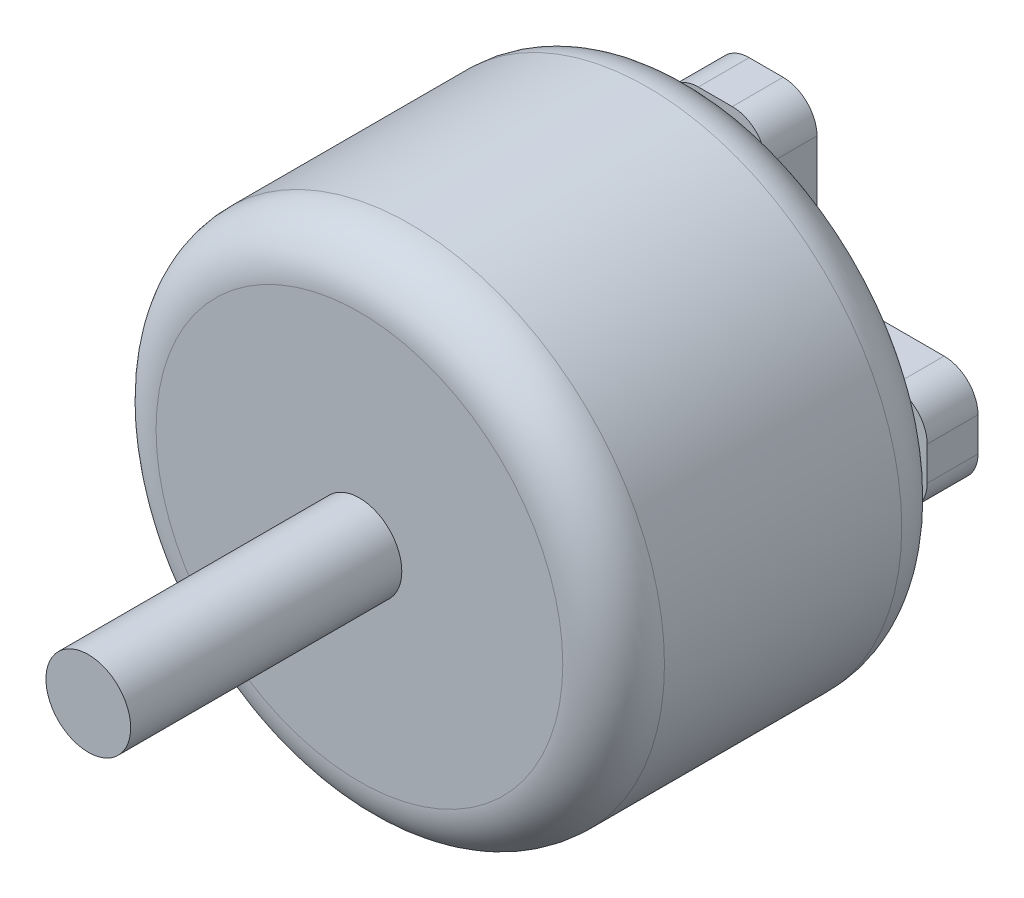
ISO-10303-21;
HEADER;
FILE_DESCRIPTION(('STEP AP214'),'2;1');
FILE_NAME('part.step','',(''),(''),'','','');
FILE_SCHEMA(('AUTOMOTIVE_DESIGN { 1 0 10303 214 1 1 1 1 }'));
ENDSEC;
DATA;
#1=APPLICATION_CONTEXT('core data for automotive mechanical design processes');
#2=APPLICATION_PROTOCOL_DEFINITION('international standard','automotive_design',2000,#1);
#3=PRODUCT_CONTEXT('',#1,'mechanical');
#4=PRODUCT('Part','Part','',(#3));
#5=PRODUCT_RELATED_PRODUCT_CATEGORY('part','',(#4));
#6=PRODUCT_DEFINITION_FORMATION('','',#4);
#7=PRODUCT_DEFINITION_CONTEXT('part definition',#1,'design');
#8=PRODUCT_DEFINITION('design','',#6,#7);
#9=PRODUCT_DEFINITION_SHAPE('','',#8);
#10=(LENGTH_UNIT() NAMED_UNIT(*) SI_UNIT(.MILLI.,.METRE.));
#11=(NAMED_UNIT(*) PLANE_ANGLE_UNIT() SI_UNIT($,.RADIAN.));
#12=(NAMED_UNIT(*) SI_UNIT($,.STERADIAN.) SOLID_ANGLE_UNIT());
#13=UNCERTAINTY_MEASURE_WITH_UNIT(LENGTH_MEASURE(1.E-05),#10,'distance_accuracy_value','');
#14=(GEOMETRIC_REPRESENTATION_CONTEXT(3) GLOBAL_UNCERTAINTY_ASSIGNED_CONTEXT((#13)) GLOBAL_UNIT_ASSIGNED_CONTEXT((#10,
#11,#12)) REPRESENTATION_CONTEXT('',''));
#15=CARTESIAN_POINT('',(0.,0.,0.));
#16=DIRECTION('',(0.,0.,1.));
#17=DIRECTION('',(1.,0.,0.));
#18=AXIS2_PLACEMENT_3D('',#15,#16,#17);
#19=CARTESIAN_POINT('',(-83.7817459305203,-83.7817459305202,3.));
#20=DIRECTION('',(0.,0.,1.));
#21=DIRECTION('',(1.,0.,0.));
#22=AXIS2_PLACEMENT_3D('',#19,#20,#21);
#23=PLANE('',#22);
#24=CARTESIAN_POINT('',(-77.7817459305204,-77.7817459305201,3.));
#25=DIRECTION('',(0.,0.,1.));
#26=DIRECTION('',(1.,0.,0.));
#27=AXIS2_PLACEMENT_3D('',#24,#25,#26);
#28=CIRCLE('',#27,2.85201126427934);
#29=CARTESIAN_POINT('',(-74.9297346662411,-77.7817459305201,3.));
#30=VERTEX_POINT('',#29);
#31=EDGE_CURVE('E371',#30,#30,#28,.T.);
#32=ORIENTED_EDGE('',*,*,#31,.F.);
#33=EDGE_LOOP('',(#32));
#34=FACE_BOUND('',#33,.T.);
#35=CARTESIAN_POINT('',(-77.7817459305203,-87.2817459305201,3.));
#36=DIRECTION('',(0.,0.,1.));
#37=DIRECTION('',(1.,0.,0.));
#38=AXIS2_PLACEMENT_3D('',#35,#36,#37);
#39=CIRCLE('',#38,1.59999999999992);
#40=CARTESIAN_POINT('',(-76.1817459305204,-87.2817459305201,3.));
#41=VERTEX_POINT('',#40);
#42=EDGE_CURVE('E380',#41,#41,#39,.T.);
#43=ORIENTED_EDGE('',*,*,#42,.F.);
#44=EDGE_LOOP('',(#43));
#45=FACE_BOUND('',#44,.T.);
#46=CARTESIAN_POINT('',(-77.7817459305205,-68.2817459305201,3.));
#47=DIRECTION('',(0.,0.,1.));
#48=DIRECTION('',(1.,0.,0.));
#49=AXIS2_PLACEMENT_3D('',#46,#47,#48);
#50=CIRCLE('',#49,1.60000000000002);
#51=CARTESIAN_POINT('',(-76.1817459305204,-68.2817459305201,3.));
#52=VERTEX_POINT('',#51);
#53=EDGE_CURVE('E231',#52,#52,#50,.T.);
#54=ORIENTED_EDGE('',*,*,#53,.F.);
#55=EDGE_LOOP('',(#54));
#56=FACE_BOUND('',#55,.T.);
#57=CARTESIAN_POINT('',(-83.7817459305203,-83.7817459305202,3.));
#58=DIRECTION('',(0.,0.,-1.));
#59=DIRECTION('',(1.,0.,0.));
#60=AXIS2_PLACEMENT_3D('',#57,#58,#59);
#61=CIRCLE('',#60,3.);
#62=CARTESIAN_POINT('',(-83.7817459305203,-80.7817459305202,3.));
#63=VERTEX_POINT('',#62);
#64=CARTESIAN_POINT('',(-80.7817459305203,-83.7817459305202,3.));
#65=VERTEX_POINT('',#64);
#66=EDGE_CURVE('E274',#63,#65,#61,.T.);
#67=ORIENTED_EDGE('',*,*,#66,.T.);
#68=DIRECTION('',(0.,-1.,0.));
#69=VECTOR('',#68,1.);
#70=CARTESIAN_POINT('',(-80.7817459305203,-83.7817459305202,3.));
#71=LINE('',#70,#69);
#72=CARTESIAN_POINT('',(-80.7817459305203,-88.2817459305201,3.));
#73=VERTEX_POINT('',#72);
#74=EDGE_CURVE('E142',#65,#73,#71,.T.);
#75=ORIENTED_EDGE('',*,*,#74,.T.);
#76=CARTESIAN_POINT('',(-78.7817459305203,-88.2817459305201,3.));
#77=DIRECTION('',(0.,0.,1.));
#78=DIRECTION('',(1.,0.,0.));
#79=AXIS2_PLACEMENT_3D('',#76,#77,#78);
#80=CIRCLE('',#79,2.);
#81=CARTESIAN_POINT('',(-78.7817459305203,-90.2817459305201,3.));
#82=VERTEX_POINT('',#81);
#83=EDGE_CURVE('E398',#73,#82,#80,.T.);
#84=ORIENTED_EDGE('',*,*,#83,.T.);
#85=DIRECTION('',(1.,0.,0.));
#86=VECTOR('',#85,1.);
#87=CARTESIAN_POINT('',(-78.7817459305203,-90.2817459305201,3.));
#88=LINE('',#87,#86);
#89=CARTESIAN_POINT('',(-76.7817459305203,-90.2817459305201,3.));
#90=VERTEX_POINT('',#89);
#91=EDGE_CURVE('E400',#82,#90,#88,.T.);
#92=ORIENTED_EDGE('',*,*,#91,.T.);
#93=CARTESIAN_POINT('',(-76.7817459305203,-88.2817459305201,3.));
#94=DIRECTION('',(0.,0.,1.));
#95=DIRECTION('',(1.,0.,0.));
#96=AXIS2_PLACEMENT_3D('',#93,#94,#95);
#97=CIRCLE('',#96,2.);
#98=CARTESIAN_POINT('',(-74.7817459305203,-88.2817459305201,3.));
#99=VERTEX_POINT('',#98);
#100=EDGE_CURVE('E402',#90,#99,#97,.T.);
#101=ORIENTED_EDGE('',*,*,#100,.T.);
#102=DIRECTION('',(0.,1.,0.));
#103=VECTOR('',#102,1.);
#104=CARTESIAN_POINT('',(-74.7817459305203,-83.7817459305202,3.));
#105=LINE('',#104,#103);
#106=CARTESIAN_POINT('',(-74.7817459305203,-83.7817459305202,3.));
#107=VERTEX_POINT('',#106);
#108=EDGE_CURVE('E404',#99,#107,#105,.T.);
#109=ORIENTED_EDGE('',*,*,#108,.T.);
#110=CARTESIAN_POINT('',(-71.7817459305203,-83.7817459305202,3.));
#111=DIRECTION('',(0.,0.,-1.));
#112=DIRECTION('',(-1.,0.,0.));
#113=AXIS2_PLACEMENT_3D('',#110,#111,#112);
#114=CIRCLE('',#113,3.);
#115=CARTESIAN_POINT('',(-71.7817459305203,-80.7817459305202,3.));
#116=VERTEX_POINT('',#115);
#117=EDGE_CURVE('E406',#107,#116,#114,.T.);
#118=ORIENTED_EDGE('',*,*,#117,.T.);
#119=DIRECTION('',(1.,0.,0.));
#120=VECTOR('',#119,1.);
#121=CARTESIAN_POINT('',(-71.7817459305203,-80.7817459305202,3.));
#122=LINE('',#121,#120);
#123=CARTESIAN_POINT('',(-67.2817459305204,-80.7817459305202,3.));
#124=VERTEX_POINT('',#123);
#125=EDGE_CURVE('E408',#116,#124,#122,.T.);
#126=ORIENTED_EDGE('',*,*,#125,.T.);
#127=CARTESIAN_POINT('',(-67.2817459305204,-78.7817459305202,3.));
#128=DIRECTION('',(0.,0.,1.));
#129=DIRECTION('',(1.,0.,0.));
#130=AXIS2_PLACEMENT_3D('',#127,#128,#129);
#131=CIRCLE('',#130,2.);
#132=CARTESIAN_POINT('',(-65.2817459305204,-78.7817459305202,3.));
#133=VERTEX_POINT('',#132);
#134=EDGE_CURVE('E410',#124,#133,#131,.T.);
#135=ORIENTED_EDGE('',*,*,#134,.T.);
#136=DIRECTION('',(0.,1.,0.));
#137=VECTOR('',#136,1.);
#138=CARTESIAN_POINT('',(-65.2817459305204,-76.7817459305202,3.));
#139=LINE('',#138,#137);
#140=CARTESIAN_POINT('',(-65.2817459305204,-76.7817459305202,3.));
#141=VERTEX_POINT('',#140);
#142=EDGE_CURVE('E412',#133,#141,#139,.T.);
#143=ORIENTED_EDGE('',*,*,#142,.T.);
#144=CARTESIAN_POINT('',(-67.2817459305204,-76.7817459305202,3.));
#145=DIRECTION('',(0.,0.,1.));
#146=DIRECTION('',(-1.,0.,0.));
#147=AXIS2_PLACEMENT_3D('',#144,#145,#146);
#148=CIRCLE('',#147,2.);
#149=CARTESIAN_POINT('',(-67.2817459305204,-74.7817459305202,3.));
#150=VERTEX_POINT('',#149);
#151=EDGE_CURVE('E414',#141,#150,#148,.T.);
#152=ORIENTED_EDGE('',*,*,#151,.T.);
#153=DIRECTION('',(-1.,0.,0.));
#154=VECTOR('',#153,1.);
#155=CARTESIAN_POINT('',(-71.7817459305203,-74.7817459305202,3.));
#156=LINE('',#155,#154);
#157=CARTESIAN_POINT('',(-71.7817459305203,-74.7817459305202,3.));
#158=VERTEX_POINT('',#157);
#159=EDGE_CURVE('E416',#150,#158,#156,.T.);
#160=ORIENTED_EDGE('',*,*,#159,.T.);
#161=CARTESIAN_POINT('',(-71.7817459305203,-71.7817459305202,3.));
#162=DIRECTION('',(0.,0.,-1.));
#163=DIRECTION('',(-1.,0.,0.));
#164=AXIS2_PLACEMENT_3D('',#161,#162,#163);
#165=CIRCLE('',#164,3.);
#166=CARTESIAN_POINT('',(-74.7817459305203,-71.7817459305202,3.));
#167=VERTEX_POINT('',#166);
#168=EDGE_CURVE('E418',#158,#167,#165,.T.);
#169=ORIENTED_EDGE('',*,*,#168,.T.);
#170=DIRECTION('',(0.,1.,0.));
#171=VECTOR('',#170,1.);
#172=CARTESIAN_POINT('',(-74.7817459305203,-67.2817459305201,3.));
#173=LINE('',#172,#171);
#174=CARTESIAN_POINT('',(-74.7817459305203,-67.2817459305201,3.));
#175=VERTEX_POINT('',#174);
#176=EDGE_CURVE('E420',#167,#175,#173,.T.);
#177=ORIENTED_EDGE('',*,*,#176,.T.);
#178=CARTESIAN_POINT('',(-76.7817459305203,-67.2817459305201,3.));
#179=DIRECTION('',(0.,0.,1.));
#180=DIRECTION('',(-1.,0.,0.));
#181=AXIS2_PLACEMENT_3D('',#178,#179,#180);
#182=CIRCLE('',#181,2.);
#183=CARTESIAN_POINT('',(-76.7817459305203,-65.2817459305201,3.));
#184=VERTEX_POINT('',#183);
#185=EDGE_CURVE('E422',#175,#184,#182,.T.);
#186=ORIENTED_EDGE('',*,*,#185,.T.);
#187=DIRECTION('',(-1.,0.,0.));
#188=VECTOR('',#187,1.);
#189=CARTESIAN_POINT('',(-78.7817459305203,-65.2817459305201,3.));
#190=LINE('',#189,#188);
#191=CARTESIAN_POINT('',(-78.7817459305203,-65.2817459305201,3.));
#192=VERTEX_POINT('',#191);
#193=EDGE_CURVE('E424',#184,#192,#190,.T.);
#194=ORIENTED_EDGE('',*,*,#193,.T.);
#195=CARTESIAN_POINT('',(-78.7817459305203,-67.2817459305201,3.));
#196=DIRECTION('',(0.,0.,1.));
#197=DIRECTION('',(1.,0.,0.));
#198=AXIS2_PLACEMENT_3D('',#195,#196,#197);
#199=CIRCLE('',#198,2.);
#200=CARTESIAN_POINT('',(-80.7817459305203,-67.2817459305201,3.));
#201=VERTEX_POINT('',#200);
#202=EDGE_CURVE('E426',#192,#201,#199,.T.);
#203=ORIENTED_EDGE('',*,*,#202,.T.);
#204=DIRECTION('',(0.,-1.,0.));
#205=VECTOR('',#204,1.);
#206=CARTESIAN_POINT('',(-80.7817459305203,-67.2817459305201,3.));
#207=LINE('',#206,#205);
#208=CARTESIAN_POINT('',(-80.7817459305203,-71.7817459305202,3.));
#209=VERTEX_POINT('',#208);
#210=EDGE_CURVE('E428',#201,#209,#207,.T.);
#211=ORIENTED_EDGE('',*,*,#210,.T.);
#212=CARTESIAN_POINT('',(-83.7817459305203,-71.7817459305202,3.));
#213=DIRECTION('',(0.,0.,-1.));
#214=DIRECTION('',(1.,0.,0.));
#215=AXIS2_PLACEMENT_3D('',#212,#213,#214);
#216=CIRCLE('',#215,3.);
#217=CARTESIAN_POINT('',(-83.7817459305203,-74.7817459305202,3.));
#218=VERTEX_POINT('',#217);
#219=EDGE_CURVE('E430',#209,#218,#216,.T.);
#220=ORIENTED_EDGE('',*,*,#219,.T.);
#221=DIRECTION('',(-1.,0.,0.));
#222=VECTOR('',#221,1.);
#223=CARTESIAN_POINT('',(-88.2817459305204,-74.7817459305202,3.));
#224=LINE('',#223,#222);
#225=CARTESIAN_POINT('',(-88.2817459305204,-74.7817459305202,3.));
#226=VERTEX_POINT('',#225);
#227=EDGE_CURVE('E432',#218,#226,#224,.T.);
#228=ORIENTED_EDGE('',*,*,#227,.T.);
#229=CARTESIAN_POINT('',(-88.2817459305204,-76.7817459305202,3.));
#230=DIRECTION('',(0.,0.,1.));
#231=DIRECTION('',(1.,0.,0.));
#232=AXIS2_PLACEMENT_3D('',#229,#230,#231);
#233=CIRCLE('',#232,2.);
#234=CARTESIAN_POINT('',(-90.2817459305204,-76.7817459305202,3.));
#235=VERTEX_POINT('',#234);
#236=EDGE_CURVE('E209',#226,#235,#233,.T.);
#237=ORIENTED_EDGE('',*,*,#236,.T.);
#238=DIRECTION('',(0.,-1.,0.));
#239=VECTOR('',#238,1.);
#240=CARTESIAN_POINT('',(-90.2817459305204,-76.7817459305202,3.));
#241=LINE('',#240,#239);
#242=CARTESIAN_POINT('',(-90.2817459305204,-78.7817459305202,3.));
#243=VERTEX_POINT('',#242);
#244=EDGE_CURVE('E203',#235,#243,#241,.T.);
#245=ORIENTED_EDGE('',*,*,#244,.T.);
#246=CARTESIAN_POINT('',(-88.2817459305204,-78.7817459305202,3.));
#247=DIRECTION('',(0.,0.,1.));
#248=DIRECTION('',(1.,0.,0.));
#249=AXIS2_PLACEMENT_3D('',#246,#247,#248);
#250=CIRCLE('',#249,2.);
#251=CARTESIAN_POINT('',(-88.2817459305204,-80.7817459305202,3.));
#252=VERTEX_POINT('',#251);
#253=EDGE_CURVE('E207',#243,#252,#250,.T.);
#254=ORIENTED_EDGE('',*,*,#253,.T.);
#255=DIRECTION('',(1.,0.,0.));
#256=VECTOR('',#255,1.);
#257=CARTESIAN_POINT('',(-88.2817459305204,-80.7817459305202,3.));
#258=LINE('',#257,#256);
#259=EDGE_CURVE('E50',#252,#63,#258,.T.);
#260=ORIENTED_EDGE('',*,*,#259,.T.);
#261=EDGE_LOOP('',(#67,#75,#84,#92,#101,#109,#118,#126,#135,#143,#152,#160,#169,#177,#186,#194,
#203,#211,#220,#228,#237,#245,#254,#260));
#262=FACE_BOUND('',#261,.T.);
#263=CARTESIAN_POINT('',(-68.2817459305204,-77.7817459305201,3.));
#264=DIRECTION('',(0.,0.,1.));
#265=DIRECTION('',(1.,0.,0.));
#266=AXIS2_PLACEMENT_3D('',#263,#264,#265);
#267=CIRCLE('',#266,1.59999999999995);
#268=CARTESIAN_POINT('',(-66.6817459305205,-77.7817459305201,3.));
#269=VERTEX_POINT('',#268);
#270=EDGE_CURVE('E386',#269,#269,#267,.T.);
#271=ORIENTED_EDGE('',*,*,#270,.F.);
#272=EDGE_LOOP('',(#271));
#273=FACE_BOUND('',#272,.T.);
#274=CARTESIAN_POINT('',(-87.2817459305204,-77.7817459305202,3.));
#275=DIRECTION('',(0.,0.,1.));
#276=DIRECTION('',(1.,0.,0.));
#277=AXIS2_PLACEMENT_3D('',#274,#275,#276);
#278=CIRCLE('',#277,1.60000000000001);
#279=CARTESIAN_POINT('',(-85.6817459305204,-77.7817459305202,3.));
#280=VERTEX_POINT('',#279);
#281=EDGE_CURVE('E374',#280,#280,#278,.T.);
#282=ORIENTED_EDGE('',*,*,#281,.F.);
#283=EDGE_LOOP('',(#282));
#284=FACE_BOUND('',#283,.T.);
#285=ADVANCED_FACE('F33',(#34,#45,#56,#262,#273,#284),#23,.T.);
#286=CARTESIAN_POINT('',(-83.7817459305203,-83.7817459305202,0.));
#287=DIRECTION('',(0.,0.,1.));
#288=DIRECTION('',(1.,0.,0.));
#289=AXIS2_PLACEMENT_3D('',#286,#287,#288);
#290=PLANE('',#289);
#291=CARTESIAN_POINT('',(-83.7817459305203,-83.7817459305202,0.));
#292=DIRECTION('',(0.,0.,-1.));
#293=DIRECTION('',(1.,0.,0.));
#294=AXIS2_PLACEMENT_3D('',#291,#292,#293);
#295=CIRCLE('',#294,3.);
#296=CARTESIAN_POINT('',(-83.7817459305203,-80.7817459305202,0.));
#297=VERTEX_POINT('',#296);
#298=CARTESIAN_POINT('',(-80.7817459305203,-83.7817459305202,0.));
#299=VERTEX_POINT('',#298);
#300=EDGE_CURVE('E227',#297,#299,#295,.T.);
#301=ORIENTED_EDGE('',*,*,#300,.F.);
#302=DIRECTION('',(1.,0.,0.));
#303=VECTOR('',#302,1.);
#304=CARTESIAN_POINT('',(-88.2817459305204,-80.7817459305202,0.));
#305=LINE('',#304,#303);
#306=CARTESIAN_POINT('',(-88.2817459305204,-80.7817459305202,0.));
#307=VERTEX_POINT('',#306);
#308=EDGE_CURVE('E133',#307,#297,#305,.T.);
#309=ORIENTED_EDGE('',*,*,#308,.F.);
#310=CARTESIAN_POINT('',(-88.2817459305204,-78.7817459305202,0.));
#311=DIRECTION('',(0.,0.,1.));
#312=DIRECTION('',(1.,0.,0.));
#313=AXIS2_PLACEMENT_3D('',#310,#311,#312);
#314=CIRCLE('',#313,2.);
#315=CARTESIAN_POINT('',(-90.2817459305204,-78.7817459305202,0.));
#316=VERTEX_POINT('',#315);
#317=EDGE_CURVE('E127',#316,#307,#314,.T.);
#318=ORIENTED_EDGE('',*,*,#317,.F.);
#319=DIRECTION('',(0.,-1.,0.));
#320=VECTOR('',#319,1.);
#321=CARTESIAN_POINT('',(-90.2817459305204,-76.7817459305202,0.));
#322=LINE('',#321,#320);
#323=CARTESIAN_POINT('',(-90.2817459305204,-76.7817459305202,0.));
#324=VERTEX_POINT('',#323);
#325=EDGE_CURVE('E217',#324,#316,#322,.T.);
#326=ORIENTED_EDGE('',*,*,#325,.F.);
#327=CARTESIAN_POINT('',(-88.2817459305204,-76.7817459305202,0.));
#328=DIRECTION('',(0.,0.,1.));
#329=DIRECTION('',(1.,0.,0.));
#330=AXIS2_PLACEMENT_3D('',#327,#328,#329);
#331=CIRCLE('',#330,2.);
#332=CARTESIAN_POINT('',(-88.2817459305204,-74.7817459305202,0.));
#333=VERTEX_POINT('',#332);
#334=EDGE_CURVE('E269',#333,#324,#331,.T.);
#335=ORIENTED_EDGE('',*,*,#334,.F.);
#336=DIRECTION('',(-1.,0.,0.));
#337=VECTOR('',#336,1.);
#338=CARTESIAN_POINT('',(-88.2817459305204,-74.7817459305202,0.));
#339=LINE('',#338,#337);
#340=CARTESIAN_POINT('',(-83.7817459305203,-74.7817459305202,0.));
#341=VERTEX_POINT('',#340);
#342=EDGE_CURVE('E267',#341,#333,#339,.T.);
#343=ORIENTED_EDGE('',*,*,#342,.F.);
#344=CARTESIAN_POINT('',(-83.7817459305203,-71.7817459305202,0.));
#345=DIRECTION('',(0.,0.,-1.));
#346=DIRECTION('',(1.,0.,0.));
#347=AXIS2_PLACEMENT_3D('',#344,#345,#346);
#348=CIRCLE('',#347,3.);
#349=CARTESIAN_POINT('',(-80.7817459305203,-71.7817459305202,0.));
#350=VERTEX_POINT('',#349);
#351=EDGE_CURVE('E265',#350,#341,#348,.T.);
#352=ORIENTED_EDGE('',*,*,#351,.F.);
#353=DIRECTION('',(0.,-1.,0.));
#354=VECTOR('',#353,1.);
#355=CARTESIAN_POINT('',(-80.7817459305203,-67.2817459305201,0.));
#356=LINE('',#355,#354);
#357=CARTESIAN_POINT('',(-80.7817459305203,-67.2817459305201,0.));
#358=VERTEX_POINT('',#357);
#359=EDGE_CURVE('E263',#358,#350,#356,.T.);
#360=ORIENTED_EDGE('',*,*,#359,.F.);
#361=CARTESIAN_POINT('',(-78.7817459305203,-67.2817459305201,0.));
#362=DIRECTION('',(0.,0.,1.));
#363=DIRECTION('',(1.,0.,0.));
#364=AXIS2_PLACEMENT_3D('',#361,#362,#363);
#365=CIRCLE('',#364,2.);
#366=CARTESIAN_POINT('',(-78.7817459305203,-65.2817459305201,0.));
#367=VERTEX_POINT('',#366);
#368=EDGE_CURVE('E261',#367,#358,#365,.T.);
#369=ORIENTED_EDGE('',*,*,#368,.F.);
#370=DIRECTION('',(-1.,0.,0.));
#371=VECTOR('',#370,1.);
#372=CARTESIAN_POINT('',(-78.7817459305203,-65.2817459305201,0.));
#373=LINE('',#372,#371);
#374=CARTESIAN_POINT('',(-76.7817459305203,-65.2817459305201,0.));
#375=VERTEX_POINT('',#374);
#376=EDGE_CURVE('E259',#375,#367,#373,.T.);
#377=ORIENTED_EDGE('',*,*,#376,.F.);
#378=CARTESIAN_POINT('',(-76.7817459305203,-67.2817459305201,0.));
#379=DIRECTION('',(0.,0.,1.));
#380=DIRECTION('',(-1.,0.,0.));
#381=AXIS2_PLACEMENT_3D('',#378,#379,#380);
#382=CIRCLE('',#381,2.);
#383=CARTESIAN_POINT('',(-74.7817459305203,-67.2817459305201,0.));
#384=VERTEX_POINT('',#383);
#385=EDGE_CURVE('E257',#384,#375,#382,.T.);
#386=ORIENTED_EDGE('',*,*,#385,.F.);
#387=DIRECTION('',(0.,1.,0.));
#388=VECTOR('',#387,1.);
#389=CARTESIAN_POINT('',(-74.7817459305203,-67.2817459305201,0.));
#390=LINE('',#389,#388);
#391=CARTESIAN_POINT('',(-74.7817459305203,-71.7817459305202,0.));
#392=VERTEX_POINT('',#391);
#393=EDGE_CURVE('E255',#392,#384,#390,.T.);
#394=ORIENTED_EDGE('',*,*,#393,.F.);
#395=CARTESIAN_POINT('',(-71.7817459305203,-71.7817459305202,0.));
#396=DIRECTION('',(0.,0.,-1.));
#397=DIRECTION('',(-1.,0.,0.));
#398=AXIS2_PLACEMENT_3D('',#395,#396,#397);
#399=CIRCLE('',#398,3.);
#400=CARTESIAN_POINT('',(-71.7817459305203,-74.7817459305202,0.));
#401=VERTEX_POINT('',#400);
#402=EDGE_CURVE('E253',#401,#392,#399,.T.);
#403=ORIENTED_EDGE('',*,*,#402,.F.);
#404=DIRECTION('',(-1.,0.,0.));
#405=VECTOR('',#404,1.);
#406=CARTESIAN_POINT('',(-71.7817459305203,-74.7817459305202,0.));
#407=LINE('',#406,#405);
#408=CARTESIAN_POINT('',(-67.2817459305204,-74.7817459305202,0.));
#409=VERTEX_POINT('',#408);
#410=EDGE_CURVE('E251',#409,#401,#407,.T.);
#411=ORIENTED_EDGE('',*,*,#410,.F.);
#412=CARTESIAN_POINT('',(-67.2817459305204,-76.7817459305202,0.));
#413=DIRECTION('',(0.,0.,1.));
#414=DIRECTION('',(-1.,0.,0.));
#415=AXIS2_PLACEMENT_3D('',#412,#413,#414);
#416=CIRCLE('',#415,2.);
#417=CARTESIAN_POINT('',(-65.2817459305204,-76.7817459305202,0.));
#418=VERTEX_POINT('',#417);
#419=EDGE_CURVE('E249',#418,#409,#416,.T.);
#420=ORIENTED_EDGE('',*,*,#419,.F.);
#421=DIRECTION('',(0.,1.,0.));
#422=VECTOR('',#421,1.);
#423=CARTESIAN_POINT('',(-65.2817459305204,-76.7817459305202,0.));
#424=LINE('',#423,#422);
#425=CARTESIAN_POINT('',(-65.2817459305204,-78.7817459305202,0.));
#426=VERTEX_POINT('',#425);
#427=EDGE_CURVE('E247',#426,#418,#424,.T.);
#428=ORIENTED_EDGE('',*,*,#427,.F.);
#429=CARTESIAN_POINT('',(-67.2817459305204,-78.7817459305202,0.));
#430=DIRECTION('',(0.,0.,1.));
#431=DIRECTION('',(1.,0.,0.));
#432=AXIS2_PLACEMENT_3D('',#429,#430,#431);
#433=CIRCLE('',#432,2.);
#434=CARTESIAN_POINT('',(-67.2817459305204,-80.7817459305202,0.));
#435=VERTEX_POINT('',#434);
#436=EDGE_CURVE('E245',#435,#426,#433,.T.);
#437=ORIENTED_EDGE('',*,*,#436,.F.);
#438=DIRECTION('',(1.,0.,0.));
#439=VECTOR('',#438,1.);
#440=CARTESIAN_POINT('',(-71.7817459305203,-80.7817459305202,0.));
#441=LINE('',#440,#439);
#442=CARTESIAN_POINT('',(-71.7817459305203,-80.7817459305202,0.));
#443=VERTEX_POINT('',#442);
#444=EDGE_CURVE('E243',#443,#435,#441,.T.);
#445=ORIENTED_EDGE('',*,*,#444,.F.);
#446=CARTESIAN_POINT('',(-71.7817459305203,-83.7817459305202,0.));
#447=DIRECTION('',(0.,0.,-1.));
#448=DIRECTION('',(-1.,0.,0.));
#449=AXIS2_PLACEMENT_3D('',#446,#447,#448);
#450=CIRCLE('',#449,3.);
#451=CARTESIAN_POINT('',(-74.7817459305203,-83.7817459305202,0.));
#452=VERTEX_POINT('',#451);
#453=EDGE_CURVE('E241',#452,#443,#450,.T.);
#454=ORIENTED_EDGE('',*,*,#453,.F.);
#455=DIRECTION('',(0.,1.,0.));
#456=VECTOR('',#455,1.);
#457=CARTESIAN_POINT('',(-74.7817459305203,-83.7817459305202,0.));
#458=LINE('',#457,#456);
#459=CARTESIAN_POINT('',(-74.7817459305203,-88.2817459305201,0.));
#460=VERTEX_POINT('',#459);
#461=EDGE_CURVE('E239',#460,#452,#458,.T.);
#462=ORIENTED_EDGE('',*,*,#461,.F.);
#463=CARTESIAN_POINT('',(-76.7817459305203,-88.2817459305201,0.));
#464=DIRECTION('',(0.,0.,1.));
#465=DIRECTION('',(1.,0.,0.));
#466=AXIS2_PLACEMENT_3D('',#463,#464,#465);
#467=CIRCLE('',#466,2.);
#468=CARTESIAN_POINT('',(-76.7817459305203,-90.2817459305201,0.));
#469=VERTEX_POINT('',#468);
#470=EDGE_CURVE('E237',#469,#460,#467,.T.);
#471=ORIENTED_EDGE('',*,*,#470,.F.);
#472=DIRECTION('',(1.,0.,0.));
#473=VECTOR('',#472,1.);
#474=CARTESIAN_POINT('',(-78.7817459305203,-90.2817459305201,0.));
#475=LINE('',#474,#473);
#476=CARTESIAN_POINT('',(-78.7817459305203,-90.2817459305201,0.));
#477=VERTEX_POINT('',#476);
#478=EDGE_CURVE('E235',#477,#469,#475,.T.);
#479=ORIENTED_EDGE('',*,*,#478,.F.);
#480=CARTESIAN_POINT('',(-78.7817459305203,-88.2817459305201,0.));
#481=DIRECTION('',(0.,0.,1.));
#482=DIRECTION('',(1.,0.,0.));
#483=AXIS2_PLACEMENT_3D('',#480,#481,#482);
#484=CIRCLE('',#483,2.);
#485=CARTESIAN_POINT('',(-80.7817459305203,-88.2817459305201,0.));
#486=VERTEX_POINT('',#485);
#487=EDGE_CURVE('E233',#486,#477,#484,.T.);
#488=ORIENTED_EDGE('',*,*,#487,.F.);
#489=DIRECTION('',(0.,-1.,0.));
#490=VECTOR('',#489,1.);
#491=CARTESIAN_POINT('',(-80.7817459305203,-83.7817459305202,0.));
#492=LINE('',#491,#490);
#493=EDGE_CURVE('E230',#299,#486,#492,.T.);
#494=ORIENTED_EDGE('',*,*,#493,.F.);
#495=EDGE_LOOP('',(#301,#309,#318,#326,#335,#343,#352,#360,#369,#377,#386,#394,#403,#411,#420,
#428,#437,#445,#454,#462,#471,#479,#488,#494));
#496=FACE_BOUND('',#495,.T.);
#497=CARTESIAN_POINT('',(-77.7817459305205,-68.2817459305201,0.));
#498=DIRECTION('',(0.,0.,1.));
#499=DIRECTION('',(1.,0.,0.));
#500=AXIS2_PLACEMENT_3D('',#497,#498,#499);
#501=CIRCLE('',#500,1.60000000000002);
#502=CARTESIAN_POINT('',(-76.1817459305204,-68.2817459305201,0.));
#503=VERTEX_POINT('',#502);
#504=EDGE_CURVE('E389',#503,#503,#501,.T.);
#505=ORIENTED_EDGE('',*,*,#504,.T.);
#506=EDGE_LOOP('',(#505));
#507=FACE_BOUND('',#506,.T.);
#508=CARTESIAN_POINT('',(-68.2817459305204,-77.7817459305201,0.));
#509=DIRECTION('',(0.,0.,1.));
#510=DIRECTION('',(1.,0.,0.));
#511=AXIS2_PLACEMENT_3D('',#508,#509,#510);
#512=CIRCLE('',#511,1.59999999999995);
#513=CARTESIAN_POINT('',(-66.6817459305205,-77.7817459305201,0.));
#514=VERTEX_POINT('',#513);
#515=EDGE_CURVE('E383',#514,#514,#512,.T.);
#516=ORIENTED_EDGE('',*,*,#515,.T.);
#517=EDGE_LOOP('',(#516));
#518=FACE_BOUND('',#517,.T.);
#519=CARTESIAN_POINT('',(-77.7817459305203,-87.2817459305201,0.));
#520=DIRECTION('',(0.,0.,1.));
#521=DIRECTION('',(1.,0.,0.));
#522=AXIS2_PLACEMENT_3D('',#519,#520,#521);
#523=CIRCLE('',#522,1.59999999999992);
#524=CARTESIAN_POINT('',(-76.1817459305204,-87.2817459305201,0.));
#525=VERTEX_POINT('',#524);
#526=EDGE_CURVE('E377',#525,#525,#523,.T.);
#527=ORIENTED_EDGE('',*,*,#526,.T.);
#528=EDGE_LOOP('',(#527));
#529=FACE_BOUND('',#528,.T.);
#530=CARTESIAN_POINT('',(-87.2817459305204,-77.7817459305202,0.));
#531=DIRECTION('',(0.,0.,1.));
#532=DIRECTION('',(1.,0.,0.));
#533=AXIS2_PLACEMENT_3D('',#530,#531,#532);
#534=CIRCLE('',#533,1.60000000000001);
#535=CARTESIAN_POINT('',(-85.6817459305204,-77.7817459305202,0.));
#536=VERTEX_POINT('',#535);
#537=EDGE_CURVE('E370',#536,#536,#534,.T.);
#538=ORIENTED_EDGE('',*,*,#537,.T.);
#539=EDGE_LOOP('',(#538));
#540=FACE_BOUND('',#539,.T.);
#541=ADVANCED_FACE('F445',(#496,#507,#518,#529,#540),#290,.F.);
#542=CARTESIAN_POINT('',(-83.7817459305203,-83.7817459305202,3.));
#543=DIRECTION('',(0.,0.,-1.));
#544=DIRECTION('',(-1.,0.,0.));
#545=AXIS2_PLACEMENT_3D('',#542,#543,#544);
#546=CYLINDRICAL_SURFACE('',#545,3.);
#547=ORIENTED_EDGE('',*,*,#300,.T.);
#548=DIRECTION('',(0.,0.,-1.));
#549=VECTOR('',#548,1.);
#550=CARTESIAN_POINT('',(-80.7817459305203,-83.7817459305202,3.));
#551=LINE('',#550,#549);
#552=EDGE_CURVE('E335',#65,#299,#551,.T.);
#553=ORIENTED_EDGE('',*,*,#552,.F.);
#554=ORIENTED_EDGE('',*,*,#66,.F.);
#555=DIRECTION('',(0.,0.,-1.));
#556=VECTOR('',#555,1.);
#557=CARTESIAN_POINT('',(-83.7817459305203,-80.7817459305202,3.));
#558=LINE('',#557,#556);
#559=EDGE_CURVE('E223',#63,#297,#558,.T.);
#560=ORIENTED_EDGE('',*,*,#559,.T.);
#561=EDGE_LOOP('',(#547,#553,#554,#560));
#562=FACE_BOUND('',#561,.T.);
#563=ADVANCED_FACE('F450',(#562),#546,.F.);
#564=CARTESIAN_POINT('',(-80.7817459305203,-83.7817459305202,3.));
#565=DIRECTION('',(1.,0.,0.));
#566=DIRECTION('',(0.,0.,-1.));
#567=AXIS2_PLACEMENT_3D('',#564,#565,#566);
#568=PLANE('',#567);
#569=ORIENTED_EDGE('',*,*,#493,.T.);
#570=DIRECTION('',(0.,0.,-1.));
#571=VECTOR('',#570,1.);
#572=CARTESIAN_POINT('',(-80.7817459305203,-88.2817459305201,3.));
#573=LINE('',#572,#571);
#574=EDGE_CURVE('E332',#73,#486,#573,.T.);
#575=ORIENTED_EDGE('',*,*,#574,.F.);
#576=ORIENTED_EDGE('',*,*,#74,.F.);
#577=ORIENTED_EDGE('',*,*,#552,.T.);
#578=EDGE_LOOP('',(#569,#575,#576,#577));
#579=FACE_BOUND('',#578,.T.);
#580=ADVANCED_FACE('F749',(#579),#568,.F.);
#581=CARTESIAN_POINT('',(-78.7817459305203,-88.2817459305201,3.));
#582=DIRECTION('',(0.,0.,-1.));
#583=DIRECTION('',(-1.,0.,0.));
#584=AXIS2_PLACEMENT_3D('',#581,#582,#583);
#585=CYLINDRICAL_SURFACE('',#584,2.);
#586=ORIENTED_EDGE('',*,*,#487,.T.);
#587=DIRECTION('',(0.,0.,-1.));
#588=VECTOR('',#587,1.);
#589=CARTESIAN_POINT('',(-78.7817459305203,-90.2817459305201,3.));
#590=LINE('',#589,#588);
#591=EDGE_CURVE('E329',#82,#477,#590,.T.);
#592=ORIENTED_EDGE('',*,*,#591,.F.);
#593=ORIENTED_EDGE('',*,*,#83,.F.);
#594=ORIENTED_EDGE('',*,*,#574,.T.);
#595=EDGE_LOOP('',(#586,#592,#593,#594));
#596=FACE_BOUND('',#595,.T.);
#597=ADVANCED_FACE('F740',(#596),#585,.T.);
#598=CARTESIAN_POINT('',(-78.7817459305203,-90.2817459305201,3.));
#599=DIRECTION('',(0.,1.,0.));
#600=DIRECTION('',(0.,0.,1.));
#601=AXIS2_PLACEMENT_3D('',#598,#599,#600);
#602=PLANE('',#601);
#603=ORIENTED_EDGE('',*,*,#478,.T.);
#604=DIRECTION('',(0.,0.,-1.));
#605=VECTOR('',#604,1.);
#606=CARTESIAN_POINT('',(-76.7817459305203,-90.2817459305201,3.));
#607=LINE('',#606,#605);
#608=EDGE_CURVE('E326',#90,#469,#607,.T.);
#609=ORIENTED_EDGE('',*,*,#608,.F.);
#610=ORIENTED_EDGE('',*,*,#91,.F.);
#611=ORIENTED_EDGE('',*,*,#591,.T.);
#612=EDGE_LOOP('',(#603,#609,#610,#611));
#613=FACE_BOUND('',#612,.T.);
#614=ADVANCED_FACE('F731',(#613),#602,.F.);
#615=CARTESIAN_POINT('',(-76.7817459305203,-88.2817459305201,3.));
#616=DIRECTION('',(0.,0.,-1.));
#617=DIRECTION('',(-1.,0.,0.));
#618=AXIS2_PLACEMENT_3D('',#615,#616,#617);
#619=CYLINDRICAL_SURFACE('',#618,2.);
#620=ORIENTED_EDGE('',*,*,#470,.T.);
#621=DIRECTION('',(0.,0.,-1.));
#622=VECTOR('',#621,1.);
#623=CARTESIAN_POINT('',(-74.7817459305203,-88.2817459305201,3.));
#624=LINE('',#623,#622);
#625=EDGE_CURVE('E323',#99,#460,#624,.T.);
#626=ORIENTED_EDGE('',*,*,#625,.F.);
#627=ORIENTED_EDGE('',*,*,#100,.F.);
#628=ORIENTED_EDGE('',*,*,#608,.T.);
#629=EDGE_LOOP('',(#620,#626,#627,#628));
#630=FACE_BOUND('',#629,.T.);
#631=ADVANCED_FACE('F722',(#630),#619,.T.);
#632=CARTESIAN_POINT('',(-74.7817459305203,-83.7817459305202,3.));
#633=DIRECTION('',(-1.,0.,0.));
#634=DIRECTION('',(0.,0.,1.));
#635=AXIS2_PLACEMENT_3D('',#632,#633,#634);
#636=PLANE('',#635);
#637=ORIENTED_EDGE('',*,*,#461,.T.);
#638=DIRECTION('',(0.,0.,-1.));
#639=VECTOR('',#638,1.);
#640=CARTESIAN_POINT('',(-74.7817459305203,-83.7817459305202,3.));
#641=LINE('',#640,#639);
#642=EDGE_CURVE('E320',#107,#452,#641,.T.);
#643=ORIENTED_EDGE('',*,*,#642,.F.);
#644=ORIENTED_EDGE('',*,*,#108,.F.);
#645=ORIENTED_EDGE('',*,*,#625,.T.);
#646=EDGE_LOOP('',(#637,#643,#644,#645));
#647=FACE_BOUND('',#646,.T.);
#648=ADVANCED_FACE('F713',(#647),#636,.F.);
#649=CARTESIAN_POINT('',(-71.7817459305203,-83.7817459305202,3.));
#650=DIRECTION('',(0.,0.,-1.));
#651=DIRECTION('',(-1.,0.,0.));
#652=AXIS2_PLACEMENT_3D('',#649,#650,#651);
#653=CYLINDRICAL_SURFACE('',#652,3.);
#654=ORIENTED_EDGE('',*,*,#453,.T.);
#655=DIRECTION('',(0.,0.,-1.));
#656=VECTOR('',#655,1.);
#657=CARTESIAN_POINT('',(-71.7817459305203,-80.7817459305202,3.));
#658=LINE('',#657,#656);
#659=EDGE_CURVE('E317',#116,#443,#658,.T.);
#660=ORIENTED_EDGE('',*,*,#659,.F.);
#661=ORIENTED_EDGE('',*,*,#117,.F.);
#662=ORIENTED_EDGE('',*,*,#642,.T.);
#663=EDGE_LOOP('',(#654,#660,#661,#662));
#664=FACE_BOUND('',#663,.T.);
#665=ADVANCED_FACE('F704',(#664),#653,.F.);
#666=CARTESIAN_POINT('',(-71.7817459305203,-80.7817459305202,3.));
#667=DIRECTION('',(0.,1.,0.));
#668=DIRECTION('',(0.,0.,1.));
#669=AXIS2_PLACEMENT_3D('',#666,#667,#668);
#670=PLANE('',#669);
#671=ORIENTED_EDGE('',*,*,#444,.T.);
#672=DIRECTION('',(0.,0.,-1.));
#673=VECTOR('',#672,1.);
#674=CARTESIAN_POINT('',(-67.2817459305204,-80.7817459305202,3.));
#675=LINE('',#674,#673);
#676=EDGE_CURVE('E314',#124,#435,#675,.T.);
#677=ORIENTED_EDGE('',*,*,#676,.F.);
#678=ORIENTED_EDGE('',*,*,#125,.F.);
#679=ORIENTED_EDGE('',*,*,#659,.T.);
#680=EDGE_LOOP('',(#671,#677,#678,#679));
#681=FACE_BOUND('',#680,.T.);
#682=ADVANCED_FACE('F695',(#681),#670,.F.);
#683=CARTESIAN_POINT('',(-67.2817459305204,-78.7817459305202,3.));
#684=DIRECTION('',(0.,0.,-1.));
#685=DIRECTION('',(-1.,0.,0.));
#686=AXIS2_PLACEMENT_3D('',#683,#684,#685);
#687=CYLINDRICAL_SURFACE('',#686,2.);
#688=ORIENTED_EDGE('',*,*,#436,.T.);
#689=DIRECTION('',(0.,0.,-1.));
#690=VECTOR('',#689,1.);
#691=CARTESIAN_POINT('',(-65.2817459305204,-78.7817459305202,3.));
#692=LINE('',#691,#690);
#693=EDGE_CURVE('E311',#133,#426,#692,.T.);
#694=ORIENTED_EDGE('',*,*,#693,.F.);
#695=ORIENTED_EDGE('',*,*,#134,.F.);
#696=ORIENTED_EDGE('',*,*,#676,.T.);
#697=EDGE_LOOP('',(#688,#694,#695,#696));
#698=FACE_BOUND('',#697,.T.);
#699=ADVANCED_FACE('F686',(#698),#687,.T.);
#700=CARTESIAN_POINT('',(-65.2817459305204,-76.7817459305202,3.));
#701=DIRECTION('',(-1.,0.,0.));
#702=DIRECTION('',(0.,0.,1.));
#703=AXIS2_PLACEMENT_3D('',#700,#701,#702);
#704=PLANE('',#703);
#705=ORIENTED_EDGE('',*,*,#427,.T.);
#706=DIRECTION('',(0.,0.,-1.));
#707=VECTOR('',#706,1.);
#708=CARTESIAN_POINT('',(-65.2817459305204,-76.7817459305202,3.));
#709=LINE('',#708,#707);
#710=EDGE_CURVE('E308',#141,#418,#709,.T.);
#711=ORIENTED_EDGE('',*,*,#710,.F.);
#712=ORIENTED_EDGE('',*,*,#142,.F.);
#713=ORIENTED_EDGE('',*,*,#693,.T.);
#714=EDGE_LOOP('',(#705,#711,#712,#713));
#715=FACE_BOUND('',#714,.T.);
#716=ADVANCED_FACE('F677',(#715),#704,.F.);
#717=CARTESIAN_POINT('',(-67.2817459305204,-76.7817459305202,3.));
#718=DIRECTION('',(0.,0.,-1.));
#719=DIRECTION('',(-1.,0.,0.));
#720=AXIS2_PLACEMENT_3D('',#717,#718,#719);
#721=CYLINDRICAL_SURFACE('',#720,2.);
#722=ORIENTED_EDGE('',*,*,#419,.T.);
#723=DIRECTION('',(0.,0.,-1.));
#724=VECTOR('',#723,1.);
#725=CARTESIAN_POINT('',(-67.2817459305204,-74.7817459305202,3.));
#726=LINE('',#725,#724);
#727=EDGE_CURVE('E305',#150,#409,#726,.T.);
#728=ORIENTED_EDGE('',*,*,#727,.F.);
#729=ORIENTED_EDGE('',*,*,#151,.F.);
#730=ORIENTED_EDGE('',*,*,#710,.T.);
#731=EDGE_LOOP('',(#722,#728,#729,#730));
#732=FACE_BOUND('',#731,.T.);
#733=ADVANCED_FACE('F668',(#732),#721,.T.);
#734=CARTESIAN_POINT('',(-71.7817459305203,-74.7817459305202,3.));
#735=DIRECTION('',(0.,-1.,0.));
#736=DIRECTION('',(0.,0.,-1.));
#737=AXIS2_PLACEMENT_3D('',#734,#735,#736);
#738=PLANE('',#737);
#739=ORIENTED_EDGE('',*,*,#410,.T.);
#740=DIRECTION('',(0.,0.,-1.));
#741=VECTOR('',#740,1.);
#742=CARTESIAN_POINT('',(-71.7817459305203,-74.7817459305202,3.));
#743=LINE('',#742,#741);
#744=EDGE_CURVE('E302',#158,#401,#743,.T.);
#745=ORIENTED_EDGE('',*,*,#744,.F.);
#746=ORIENTED_EDGE('',*,*,#159,.F.);
#747=ORIENTED_EDGE('',*,*,#727,.T.);
#748=EDGE_LOOP('',(#739,#745,#746,#747));
#749=FACE_BOUND('',#748,.T.);
#750=ADVANCED_FACE('F659',(#749),#738,.F.);
#751=CARTESIAN_POINT('',(-71.7817459305203,-71.7817459305202,3.));
#752=DIRECTION('',(0.,0.,-1.));
#753=DIRECTION('',(-1.,0.,0.));
#754=AXIS2_PLACEMENT_3D('',#751,#752,#753);
#755=CYLINDRICAL_SURFACE('',#754,3.);
#756=ORIENTED_EDGE('',*,*,#402,.T.);
#757=DIRECTION('',(0.,0.,-1.));
#758=VECTOR('',#757,1.);
#759=CARTESIAN_POINT('',(-74.7817459305203,-71.7817459305202,3.));
#760=LINE('',#759,#758);
#761=EDGE_CURVE('E299',#167,#392,#760,.T.);
#762=ORIENTED_EDGE('',*,*,#761,.F.);
#763=ORIENTED_EDGE('',*,*,#168,.F.);
#764=ORIENTED_EDGE('',*,*,#744,.T.);
#765=EDGE_LOOP('',(#756,#762,#763,#764));
#766=FACE_BOUND('',#765,.T.);
#767=ADVANCED_FACE('F650',(#766),#755,.F.);
#768=CARTESIAN_POINT('',(-74.7817459305203,-67.2817459305201,3.));
#769=DIRECTION('',(-1.,0.,0.));
#770=DIRECTION('',(0.,0.,1.));
#771=AXIS2_PLACEMENT_3D('',#768,#769,#770);
#772=PLANE('',#771);
#773=ORIENTED_EDGE('',*,*,#393,.T.);
#774=DIRECTION('',(0.,0.,-1.));
#775=VECTOR('',#774,1.);
#776=CARTESIAN_POINT('',(-74.7817459305203,-67.2817459305201,3.));
#777=LINE('',#776,#775);
#778=EDGE_CURVE('E296',#175,#384,#777,.T.);
#779=ORIENTED_EDGE('',*,*,#778,.F.);
#780=ORIENTED_EDGE('',*,*,#176,.F.);
#781=ORIENTED_EDGE('',*,*,#761,.T.);
#782=EDGE_LOOP('',(#773,#779,#780,#781));
#783=FACE_BOUND('',#782,.T.);
#784=ADVANCED_FACE('F641',(#783),#772,.F.);
#785=CARTESIAN_POINT('',(-76.7817459305203,-67.2817459305201,3.));
#786=DIRECTION('',(0.,0.,-1.));
#787=DIRECTION('',(-1.,0.,0.));
#788=AXIS2_PLACEMENT_3D('',#785,#786,#787);
#789=CYLINDRICAL_SURFACE('',#788,2.);
#790=ORIENTED_EDGE('',*,*,#385,.T.);
#791=DIRECTION('',(0.,0.,-1.));
#792=VECTOR('',#791,1.);
#793=CARTESIAN_POINT('',(-76.7817459305203,-65.2817459305201,3.));
#794=LINE('',#793,#792);
#795=EDGE_CURVE('E293',#184,#375,#794,.T.);
#796=ORIENTED_EDGE('',*,*,#795,.F.);
#797=ORIENTED_EDGE('',*,*,#185,.F.);
#798=ORIENTED_EDGE('',*,*,#778,.T.);
#799=EDGE_LOOP('',(#790,#796,#797,#798));
#800=FACE_BOUND('',#799,.T.);
#801=ADVANCED_FACE('F632',(#800),#789,.T.);
#802=CARTESIAN_POINT('',(-78.7817459305203,-65.2817459305201,3.));
#803=DIRECTION('',(0.,-1.,0.));
#804=DIRECTION('',(0.,0.,-1.));
#805=AXIS2_PLACEMENT_3D('',#802,#803,#804);
#806=PLANE('',#805);
#807=ORIENTED_EDGE('',*,*,#376,.T.);
#808=DIRECTION('',(0.,0.,-1.));
#809=VECTOR('',#808,1.);
#810=CARTESIAN_POINT('',(-78.7817459305203,-65.2817459305201,3.));
#811=LINE('',#810,#809);
#812=EDGE_CURVE('E290',#192,#367,#811,.T.);
#813=ORIENTED_EDGE('',*,*,#812,.F.);
#814=ORIENTED_EDGE('',*,*,#193,.F.);
#815=ORIENTED_EDGE('',*,*,#795,.T.);
#816=EDGE_LOOP('',(#807,#813,#814,#815));
#817=FACE_BOUND('',#816,.T.);
#818=ADVANCED_FACE('F623',(#817),#806,.F.);
#819=CARTESIAN_POINT('',(-78.7817459305203,-67.2817459305201,3.));
#820=DIRECTION('',(0.,0.,-1.));
#821=DIRECTION('',(-1.,0.,0.));
#822=AXIS2_PLACEMENT_3D('',#819,#820,#821);
#823=CYLINDRICAL_SURFACE('',#822,2.);
#824=ORIENTED_EDGE('',*,*,#368,.T.);
#825=DIRECTION('',(0.,0.,-1.));
#826=VECTOR('',#825,1.);
#827=CARTESIAN_POINT('',(-80.7817459305203,-67.2817459305201,3.));
#828=LINE('',#827,#826);
#829=EDGE_CURVE('E287',#201,#358,#828,.T.);
#830=ORIENTED_EDGE('',*,*,#829,.F.);
#831=ORIENTED_EDGE('',*,*,#202,.F.);
#832=ORIENTED_EDGE('',*,*,#812,.T.);
#833=EDGE_LOOP('',(#824,#830,#831,#832));
#834=FACE_BOUND('',#833,.T.);
#835=ADVANCED_FACE('F614',(#834),#823,.T.);
#836=CARTESIAN_POINT('',(-80.7817459305203,-67.2817459305201,3.));
#837=DIRECTION('',(1.,0.,0.));
#838=DIRECTION('',(0.,0.,-1.));
#839=AXIS2_PLACEMENT_3D('',#836,#837,#838);
#840=PLANE('',#839);
#841=ORIENTED_EDGE('',*,*,#359,.T.);
#842=DIRECTION('',(0.,0.,-1.));
#843=VECTOR('',#842,1.);
#844=CARTESIAN_POINT('',(-80.7817459305203,-71.7817459305202,3.));
#845=LINE('',#844,#843);
#846=EDGE_CURVE('E284',#209,#350,#845,.T.);
#847=ORIENTED_EDGE('',*,*,#846,.F.);
#848=ORIENTED_EDGE('',*,*,#210,.F.);
#849=ORIENTED_EDGE('',*,*,#829,.T.);
#850=EDGE_LOOP('',(#841,#847,#848,#849));
#851=FACE_BOUND('',#850,.T.);
#852=ADVANCED_FACE('F605',(#851),#840,.F.);
#853=CARTESIAN_POINT('',(-83.7817459305203,-71.7817459305202,3.));
#854=DIRECTION('',(0.,0.,-1.));
#855=DIRECTION('',(-1.,0.,0.));
#856=AXIS2_PLACEMENT_3D('',#853,#854,#855);
#857=CYLINDRICAL_SURFACE('',#856,3.);
#858=ORIENTED_EDGE('',*,*,#351,.T.);
#859=DIRECTION('',(0.,0.,-1.));
#860=VECTOR('',#859,1.);
#861=CARTESIAN_POINT('',(-83.7817459305203,-74.7817459305202,3.));
#862=LINE('',#861,#860);
#863=EDGE_CURVE('E281',#218,#341,#862,.T.);
#864=ORIENTED_EDGE('',*,*,#863,.F.);
#865=ORIENTED_EDGE('',*,*,#219,.F.);
#866=ORIENTED_EDGE('',*,*,#846,.T.);
#867=EDGE_LOOP('',(#858,#864,#865,#866));
#868=FACE_BOUND('',#867,.T.);
#869=ADVANCED_FACE('F597',(#868),#857,.F.);
#870=CARTESIAN_POINT('',(-88.2817459305204,-74.7817459305202,3.));
#871=DIRECTION('',(0.,-1.,0.));
#872=DIRECTION('',(0.,0.,-1.));
#873=AXIS2_PLACEMENT_3D('',#870,#871,#872);
#874=PLANE('',#873);
#875=ORIENTED_EDGE('',*,*,#342,.T.);
#876=DIRECTION('',(0.,0.,-1.));
#877=VECTOR('',#876,1.);
#878=CARTESIAN_POINT('',(-88.2817459305204,-74.7817459305202,3.));
#879=LINE('',#878,#877);
#880=EDGE_CURVE('E278',#226,#333,#879,.T.);
#881=ORIENTED_EDGE('',*,*,#880,.F.);
#882=ORIENTED_EDGE('',*,*,#227,.F.);
#883=ORIENTED_EDGE('',*,*,#863,.T.);
#884=EDGE_LOOP('',(#875,#881,#882,#883));
#885=FACE_BOUND('',#884,.T.);
#886=ADVANCED_FACE('F438',(#885),#874,.F.);
#887=CARTESIAN_POINT('',(-88.2817459305204,-76.7817459305202,3.));
#888=DIRECTION('',(0.,0.,-1.));
#889=DIRECTION('',(-1.,0.,0.));
#890=AXIS2_PLACEMENT_3D('',#887,#888,#889);
#891=CYLINDRICAL_SURFACE('',#890,2.);
#892=ORIENTED_EDGE('',*,*,#334,.T.);
#893=DIRECTION('',(0.,0.,-1.));
#894=VECTOR('',#893,1.);
#895=CARTESIAN_POINT('',(-90.2817459305204,-76.7817459305202,3.));
#896=LINE('',#895,#894);
#897=EDGE_CURVE('E218',#235,#324,#896,.T.);
#898=ORIENTED_EDGE('',*,*,#897,.F.);
#899=ORIENTED_EDGE('',*,*,#236,.F.);
#900=ORIENTED_EDGE('',*,*,#880,.T.);
#901=EDGE_LOOP('',(#892,#898,#899,#900));
#902=FACE_BOUND('',#901,.T.);
#903=ADVANCED_FACE('F442',(#902),#891,.T.);
#904=CARTESIAN_POINT('',(-90.2817459305204,-76.7817459305202,3.));
#905=DIRECTION('',(1.,0.,0.));
#906=DIRECTION('',(0.,0.,-1.));
#907=AXIS2_PLACEMENT_3D('',#904,#905,#906);
#908=PLANE('',#907);
#909=ORIENTED_EDGE('',*,*,#325,.T.);
#910=DIRECTION('',(0.,0.,-1.));
#911=VECTOR('',#910,1.);
#912=CARTESIAN_POINT('',(-90.2817459305204,-78.7817459305202,3.));
#913=LINE('',#912,#911);
#914=EDGE_CURVE('E214',#243,#316,#913,.T.);
#915=ORIENTED_EDGE('',*,*,#914,.F.);
#916=ORIENTED_EDGE('',*,*,#244,.F.);
#917=ORIENTED_EDGE('',*,*,#897,.T.);
#918=EDGE_LOOP('',(#909,#915,#916,#917));
#919=FACE_BOUND('',#918,.T.);
#920=ADVANCED_FACE('F215',(#919),#908,.F.);
#921=CARTESIAN_POINT('',(-88.2817459305204,-78.7817459305202,3.));
#922=DIRECTION('',(0.,0.,-1.));
#923=DIRECTION('',(-1.,0.,0.));
#924=AXIS2_PLACEMENT_3D('',#921,#922,#923);
#925=CYLINDRICAL_SURFACE('',#924,2.);
#926=ORIENTED_EDGE('',*,*,#317,.T.);
#927=DIRECTION('',(0.,0.,-1.));
#928=VECTOR('',#927,1.);
#929=CARTESIAN_POINT('',(-88.2817459305204,-80.7817459305202,3.));
#930=LINE('',#929,#928);
#931=EDGE_CURVE('E219',#252,#307,#930,.T.);
#932=ORIENTED_EDGE('',*,*,#931,.F.);
#933=ORIENTED_EDGE('',*,*,#253,.F.);
#934=ORIENTED_EDGE('',*,*,#914,.T.);
#935=EDGE_LOOP('',(#926,#932,#933,#934));
#936=FACE_BOUND('',#935,.T.);
#937=ADVANCED_FACE('F221',(#936),#925,.T.);
#938=CARTESIAN_POINT('',(-88.2817459305204,-80.7817459305202,3.));
#939=DIRECTION('',(0.,1.,0.));
#940=DIRECTION('',(0.,0.,1.));
#941=AXIS2_PLACEMENT_3D('',#938,#939,#940);
#942=PLANE('',#941);
#943=ORIENTED_EDGE('',*,*,#308,.T.);
#944=ORIENTED_EDGE('',*,*,#559,.F.);
#945=ORIENTED_EDGE('',*,*,#259,.F.);
#946=ORIENTED_EDGE('',*,*,#931,.T.);
#947=EDGE_LOOP('',(#943,#944,#945,#946));
#948=FACE_BOUND('',#947,.T.);
#949=ADVANCED_FACE('F452',(#948),#942,.F.);
#950=CARTESIAN_POINT('',(-77.7817459305205,-68.2817459305201,3.));
#951=DIRECTION('',(0.,0.,-1.));
#952=DIRECTION('',(-1.,0.,0.));
#953=AXIS2_PLACEMENT_3D('',#950,#951,#952);
#954=CYLINDRICAL_SURFACE('',#953,1.60000000000002);
#955=ORIENTED_EDGE('',*,*,#53,.T.);
#956=EDGE_LOOP('',(#955));
#957=FACE_BOUND('',#956,.T.);
#958=ORIENTED_EDGE('',*,*,#504,.F.);
#959=EDGE_LOOP('',(#958));
#960=FACE_BOUND('',#959,.T.);
#961=ADVANCED_FACE('F454',(#957,#960),#954,.F.);
#962=CARTESIAN_POINT('',(-68.2817459305204,-77.7817459305201,3.));
#963=DIRECTION('',(0.,0.,-1.));
#964=DIRECTION('',(-1.,0.,0.));
#965=AXIS2_PLACEMENT_3D('',#962,#963,#964);
#966=CYLINDRICAL_SURFACE('',#965,1.59999999999995);
#967=ORIENTED_EDGE('',*,*,#270,.T.);
#968=EDGE_LOOP('',(#967));
#969=FACE_BOUND('',#968,.T.);
#970=ORIENTED_EDGE('',*,*,#515,.F.);
#971=EDGE_LOOP('',(#970));
#972=FACE_BOUND('',#971,.T.);
#973=ADVANCED_FACE('F460',(#969,#972),#966,.F.);
#974=CARTESIAN_POINT('',(-77.7817459305203,-87.2817459305201,3.));
#975=DIRECTION('',(0.,0.,-1.));
#976=DIRECTION('',(-1.,0.,0.));
#977=AXIS2_PLACEMENT_3D('',#974,#975,#976);
#978=CYLINDRICAL_SURFACE('',#977,1.59999999999992);
#979=ORIENTED_EDGE('',*,*,#42,.T.);
#980=EDGE_LOOP('',(#979));
#981=FACE_BOUND('',#980,.T.);
#982=ORIENTED_EDGE('',*,*,#526,.F.);
#983=EDGE_LOOP('',(#982));
#984=FACE_BOUND('',#983,.T.);
#985=ADVANCED_FACE('F476',(#981,#984),#978,.F.);
#986=CARTESIAN_POINT('',(-87.2817459305204,-77.7817459305202,3.));
#987=DIRECTION('',(0.,0.,-1.));
#988=DIRECTION('',(-1.,0.,0.));
#989=AXIS2_PLACEMENT_3D('',#986,#987,#988);
#990=CYLINDRICAL_SURFACE('',#989,1.60000000000001);
#991=ORIENTED_EDGE('',*,*,#281,.T.);
#992=EDGE_LOOP('',(#991));
#993=FACE_BOUND('',#992,.T.);
#994=ORIENTED_EDGE('',*,*,#537,.F.);
#995=EDGE_LOOP('',(#994));
#996=FACE_BOUND('',#995,.T.);
#997=ADVANCED_FACE('F480',(#993,#996),#990,.F.);
#998=CARTESIAN_POINT('',(-77.7817459305204,-77.7817459305201,4.));
#999=DIRECTION('',(0.,0.,-1.));
#1000=DIRECTION('',(-1.,0.,0.));
#1001=AXIS2_PLACEMENT_3D('',#998,#999,#1000);
#1002=CYLINDRICAL_SURFACE('',#1001,2.85201126427934);
#1003=CARTESIAN_POINT('',(-77.7817459305204,-77.7817459305201,4.));
#1004=DIRECTION('',(0.,0.,1.));
#1005=DIRECTION('',(1.,0.,0.));
#1006=AXIS2_PLACEMENT_3D('',#1003,#1004,#1005);
#1007=CIRCLE('',#1006,2.85201126427934);
#1008=CARTESIAN_POINT('',(-74.9297346662411,-77.7817459305201,4.));
#1009=VERTEX_POINT('',#1008);
#1010=EDGE_CURVE('E367',#1009,#1009,#1007,.T.);
#1011=ORIENTED_EDGE('',*,*,#1010,.F.);
#1012=EDGE_LOOP('',(#1011));
#1013=FACE_BOUND('',#1012,.T.);
#1014=ORIENTED_EDGE('',*,*,#31,.T.);
#1015=EDGE_LOOP('',(#1014));
#1016=FACE_BOUND('',#1015,.T.);
#1017=ADVANCED_FACE('F484',(#1013,#1016),#1002,.T.);
#1018=CARTESIAN_POINT('',(-77.7817459305204,-77.7817459305201,24.));
#1019=DIRECTION('',(0.,0.,-1.));
#1020=DIRECTION('',(-1.,0.,0.));
#1021=AXIS2_PLACEMENT_3D('',#1018,#1019,#1020);
#1022=CYLINDRICAL_SURFACE('',#1021,15.);
#1023=CARTESIAN_POINT('',(-77.7817459305204,-77.7817459305201,21.));
#1024=DIRECTION('',(0.,0.,1.));
#1025=DIRECTION('',(1.,0.,0.));
#1026=AXIS2_PLACEMENT_3D('',#1023,#1024,#1025);
#1027=CIRCLE('',#1026,15.);
#1028=CARTESIAN_POINT('',(-62.7817459305204,-77.7817459305201,21.));
#1029=VERTEX_POINT('',#1028);
#1030=EDGE_CURVE('E42',#1029,#1029,#1027,.F.);
#1031=ORIENTED_EDGE('',*,*,#1030,.T.);
#1032=EDGE_LOOP('',(#1031));
#1033=FACE_BOUND('',#1032,.T.);
#1034=CARTESIAN_POINT('',(-77.7817459305204,-77.7817459305201,7.));
#1035=DIRECTION('',(0.,0.,1.));
#1036=DIRECTION('',(1.,0.,0.));
#1037=AXIS2_PLACEMENT_3D('',#1034,#1035,#1036);
#1038=CIRCLE('',#1037,15.);
#1039=CARTESIAN_POINT('',(-62.7817459305204,-77.7817459305201,7.));
#1040=VERTEX_POINT('',#1039);
#1041=EDGE_CURVE('E341',#1040,#1040,#1038,.T.);
#1042=ORIENTED_EDGE('',*,*,#1041,.T.);
#1043=EDGE_LOOP('',(#1042));
#1044=FACE_BOUND('',#1043,.T.);
#1045=ADVANCED_FACE('F346',(#1033,#1044),#1022,.T.);
#1046=CARTESIAN_POINT('',(-77.7817459305204,-77.7817459305201,24.));
#1047=DIRECTION('',(0.,0.,1.));
#1048=DIRECTION('',(1.,0.,0.));
#1049=AXIS2_PLACEMENT_3D('',#1046,#1047,#1048);
#1050=PLANE('',#1049);
#1051=CARTESIAN_POINT('',(-77.7817459305204,-77.7817459305201,24.));
#1052=DIRECTION('',(0.,0.,1.));
#1053=DIRECTION('',(1.,0.,0.));
#1054=AXIS2_PLACEMENT_3D('',#1051,#1052,#1053);
#1055=CIRCLE('',#1054,12.);
#1056=CARTESIAN_POINT('',(-65.7817459305204,-77.7817459305201,24.));
#1057=VERTEX_POINT('',#1056);
#1058=EDGE_CURVE('E338',#1057,#1057,#1055,.T.);
#1059=ORIENTED_EDGE('',*,*,#1058,.T.);
#1060=EDGE_LOOP('',(#1059));
#1061=FACE_BOUND('',#1060,.T.);
#1062=CARTESIAN_POINT('',(-77.7817459305204,-77.7817459305201,24.));
#1063=DIRECTION('',(0.,0.,1.));
#1064=DIRECTION('',(1.,0.,0.));
#1065=AXIS2_PLACEMENT_3D('',#1062,#1063,#1064);
#1066=CIRCLE('',#1065,2.5);
#1067=CARTESIAN_POINT('',(-75.2817459305204,-77.7817459305201,24.));
#1068=VERTEX_POINT('',#1067);
#1069=EDGE_CURVE('E337',#1068,#1068,#1066,.T.);
#1070=ORIENTED_EDGE('',*,*,#1069,.F.);
#1071=EDGE_LOOP('',(#1070));
#1072=FACE_BOUND('',#1071,.T.);
#1073=ADVANCED_FACE('F355',(#1061,#1072),#1050,.T.);
#1074=CARTESIAN_POINT('',(-77.7817459305204,-77.7817459305201,4.));
#1075=DIRECTION('',(0.,0.,1.));
#1076=DIRECTION('',(1.,0.,0.));
#1077=AXIS2_PLACEMENT_3D('',#1074,#1075,#1076);
#1078=PLANE('',#1077);
#1079=CARTESIAN_POINT('',(-77.7817459305204,-77.7817459305201,4.));
#1080=DIRECTION('',(0.,0.,1.));
#1081=DIRECTION('',(1.,0.,0.));
#1082=AXIS2_PLACEMENT_3D('',#1079,#1080,#1081);
#1083=CIRCLE('',#1082,12.);
#1084=CARTESIAN_POINT('',(-65.7817459305204,-77.7817459305201,4.));
#1085=VERTEX_POINT('',#1084);
#1086=EDGE_CURVE('E11',#1085,#1085,#1083,.F.);
#1087=ORIENTED_EDGE('',*,*,#1086,.T.);
#1088=EDGE_LOOP('',(#1087));
#1089=FACE_BOUND('',#1088,.T.);
#1090=ORIENTED_EDGE('',*,*,#1010,.T.);
#1091=EDGE_LOOP('',(#1090));
#1092=FACE_BOUND('',#1091,.T.);
#1093=ADVANCED_FACE('F358',(#1089,#1092),#1078,.F.);
#1094=CARTESIAN_POINT('',(-77.7817459305204,-77.7817459305201,40.));
#1095=DIRECTION('',(0.,0.,-1.));
#1096=DIRECTION('',(-1.,0.,0.));
#1097=AXIS2_PLACEMENT_3D('',#1094,#1095,#1096);
#1098=CYLINDRICAL_SURFACE('',#1097,2.5);
#1099=CARTESIAN_POINT('',(-77.7817459305204,-77.7817459305201,40.));
#1100=DIRECTION('',(0.,0.,1.));
#1101=DIRECTION('',(1.,0.,0.));
#1102=AXIS2_PLACEMENT_3D('',#1099,#1100,#1101);
#1103=CIRCLE('',#1102,2.5);
#1104=CARTESIAN_POINT('',(-75.2817459305204,-77.7817459305201,40.));
#1105=VERTEX_POINT('',#1104);
#1106=EDGE_CURVE('E366',#1105,#1105,#1103,.T.);
#1107=ORIENTED_EDGE('',*,*,#1106,.F.);
#1108=EDGE_LOOP('',(#1107));
#1109=FACE_BOUND('',#1108,.T.);
#1110=ORIENTED_EDGE('',*,*,#1069,.T.);
#1111=EDGE_LOOP('',(#1110));
#1112=FACE_BOUND('',#1111,.T.);
#1113=ADVANCED_FACE('F492',(#1109,#1112),#1098,.T.);
#1114=CARTESIAN_POINT('',(-77.7817459305204,-77.7817459305201,40.));
#1115=DIRECTION('',(0.,0.,1.));
#1116=DIRECTION('',(1.,0.,0.));
#1117=AXIS2_PLACEMENT_3D('',#1114,#1115,#1116);
#1118=PLANE('',#1117);
#1119=ORIENTED_EDGE('',*,*,#1106,.T.);
#1120=EDGE_LOOP('',(#1119));
#1121=FACE_BOUND('',#1120,.T.);
#1122=ADVANCED_FACE('F352',(#1121),#1118,.T.);
#1123=CARTESIAN_POINT('',(-77.7817459305204,-77.7817459305201,21.));
#1124=DIRECTION('',(0.,0.,1.));
#1125=DIRECTION('',(1.,0.,0.));
#1126=AXIS2_PLACEMENT_3D('',#1123,#1124,#1125);
#1127=TOROIDAL_SURFACE('',#1126,12.,3.);
#1128=ORIENTED_EDGE('',*,*,#1030,.F.);
#1129=EDGE_LOOP('',(#1128));
#1130=FACE_BOUND('',#1129,.T.);
#1131=ORIENTED_EDGE('',*,*,#1058,.F.);
#1132=EDGE_LOOP('',(#1131));
#1133=FACE_BOUND('',#1132,.T.);
#1134=ADVANCED_FACE('F349',(#1130,#1133),#1127,.T.);
#1135=CARTESIAN_POINT('',(-77.7817459305204,-77.7817459305201,7.));
#1136=DIRECTION('',(0.,0.,1.));
#1137=DIRECTION('',(1.,0.,0.));
#1138=AXIS2_PLACEMENT_3D('',#1135,#1136,#1137);
#1139=TOROIDAL_SURFACE('',#1138,12.,3.);
#1140=ORIENTED_EDGE('',*,*,#1086,.F.);
#1141=EDGE_LOOP('',(#1140));
#1142=FACE_BOUND('',#1141,.T.);
#1143=ORIENTED_EDGE('',*,*,#1041,.F.);
#1144=EDGE_LOOP('',(#1143));
#1145=FACE_BOUND('',#1144,.T.);
#1146=ADVANCED_FACE('F35',(#1142,#1145),#1139,.T.);
#1147=CLOSED_SHELL('',(#285,#541,#563,#580,#597,#614,#631,#648,#665,#682,#699,#716,#733,#750,
#767,#784,#801,#818,#835,#852,#869,#886,#903,#920,#937,#949,#961,#973,#985,#997,#1017,#1045,
#1073,#1093,#1113,#1122,#1134,#1146));
#1148=MANIFOLD_SOLID_BREP('B2',#1147);
#1149=ADVANCED_BREP_SHAPE_REPRESENTATION('',(#18,#1148),#14);
#1150=SHAPE_DEFINITION_REPRESENTATION(#9,#1149);
ENDSEC;
END-ISO-10303-21;
